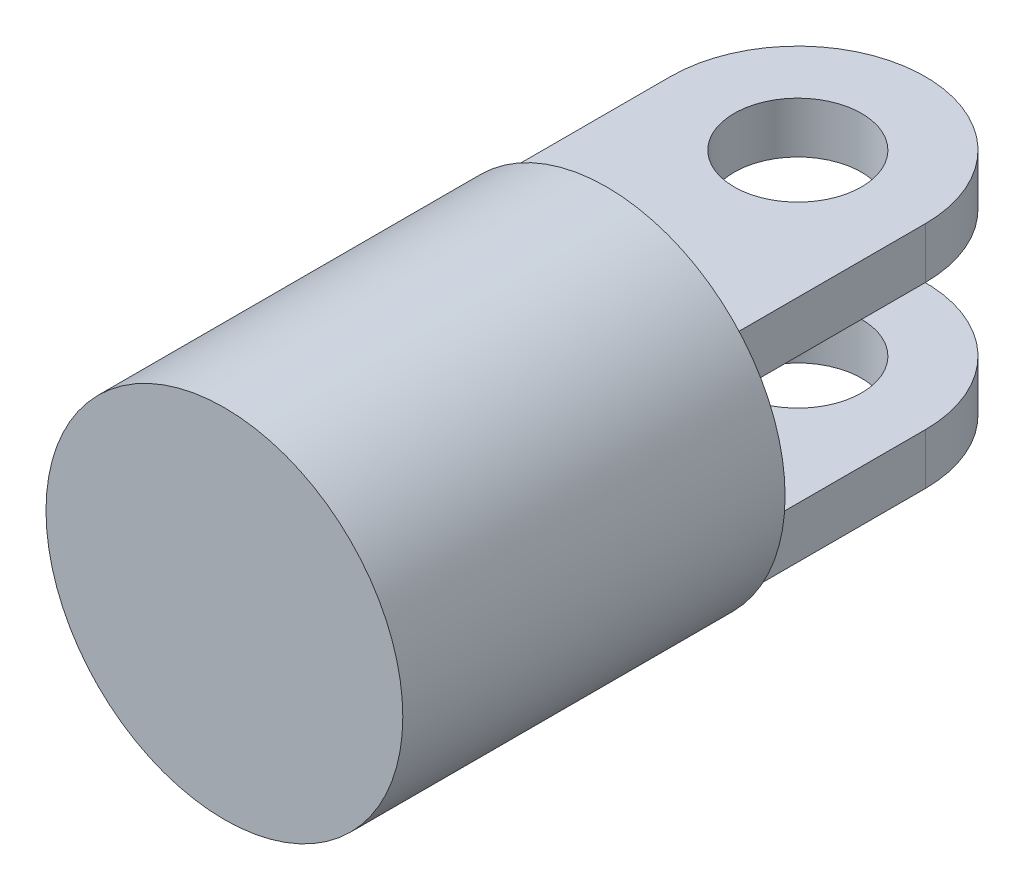
ISO-10303-21;
HEADER;
FILE_DESCRIPTION(('STEP AP214'),'2;1');
FILE_NAME('part.step','',(''),(''),'','','');
FILE_SCHEMA(('AUTOMOTIVE_DESIGN { 1 0 10303 214 1 1 1 1 }'));
ENDSEC;
DATA;
#1=APPLICATION_CONTEXT('core data for automotive mechanical design processes');
#2=APPLICATION_PROTOCOL_DEFINITION('international standard','automotive_design',2000,#1);
#3=PRODUCT_CONTEXT('',#1,'mechanical');
#4=PRODUCT('Part','Part','',(#3));
#5=PRODUCT_RELATED_PRODUCT_CATEGORY('part','',(#4));
#6=PRODUCT_DEFINITION_FORMATION('','',#4);
#7=PRODUCT_DEFINITION_CONTEXT('part definition',#1,'design');
#8=PRODUCT_DEFINITION('design','',#6,#7);
#9=PRODUCT_DEFINITION_SHAPE('','',#8);
#10=(LENGTH_UNIT() NAMED_UNIT(*) SI_UNIT(.MILLI.,.METRE.));
#11=(NAMED_UNIT(*) PLANE_ANGLE_UNIT() SI_UNIT($,.RADIAN.));
#12=(NAMED_UNIT(*) SI_UNIT($,.STERADIAN.) SOLID_ANGLE_UNIT());
#13=UNCERTAINTY_MEASURE_WITH_UNIT(LENGTH_MEASURE(1.E-05),#10,'distance_accuracy_value','');
#14=(GEOMETRIC_REPRESENTATION_CONTEXT(3) GLOBAL_UNCERTAINTY_ASSIGNED_CONTEXT((#13)) GLOBAL_UNIT_ASSIGNED_CONTEXT((#10,
#11,#12)) REPRESENTATION_CONTEXT('',''));
#15=CARTESIAN_POINT('',(0.,0.,0.));
#16=DIRECTION('',(0.,0.,1.));
#17=DIRECTION('',(1.,0.,0.));
#18=AXIS2_PLACEMENT_3D('',#15,#16,#17);
#19=CARTESIAN_POINT('',(0.,9.,-15.));
#20=DIRECTION('',(0.,-1.,0.));
#21=DIRECTION('',(0.,0.,-1.));
#22=AXIS2_PLACEMENT_3D('',#19,#20,#21);
#23=CYLINDRICAL_SURFACE('',#22,10.);
#24=CARTESIAN_POINT('',(0.,-5.,-15.));
#25=DIRECTION('',(0.,1.,0.));
#26=DIRECTION('',(0.,0.,1.));
#27=AXIS2_PLACEMENT_3D('',#24,#25,#26);
#28=CIRCLE('',#27,10.);
#29=CARTESIAN_POINT('',(10.,-5.,-15.));
#30=VERTEX_POINT('',#29);
#31=CARTESIAN_POINT('',(-10.,-5.,-15.));
#32=VERTEX_POINT('',#31);
#33=EDGE_CURVE('E107',#30,#32,#28,.T.);
#34=ORIENTED_EDGE('',*,*,#33,.F.);
#35=DIRECTION('',(0.,-1.,0.));
#36=VECTOR('',#35,1.);
#37=CARTESIAN_POINT('',(10.,9.,-15.));
#38=LINE('',#37,#36);
#39=CARTESIAN_POINT('',(10.,-9.,-15.));
#40=VERTEX_POINT('',#39);
#41=EDGE_CURVE('E149',#30,#40,#38,.T.);
#42=ORIENTED_EDGE('',*,*,#41,.T.);
#43=CARTESIAN_POINT('',(0.,-9.,-15.));
#44=DIRECTION('',(0.,1.,0.));
#45=DIRECTION('',(0.,0.,1.));
#46=AXIS2_PLACEMENT_3D('',#43,#44,#45);
#47=CIRCLE('',#46,10.);
#48=CARTESIAN_POINT('',(-10.,-9.,-15.));
#49=VERTEX_POINT('',#48);
#50=EDGE_CURVE('E129',#40,#49,#47,.T.);
#51=ORIENTED_EDGE('',*,*,#50,.T.);
#52=DIRECTION('',(0.,-1.,0.));
#53=VECTOR('',#52,1.);
#54=CARTESIAN_POINT('',(-10.,9.,-15.));
#55=LINE('',#54,#53);
#56=EDGE_CURVE('E122',#32,#49,#55,.T.);
#57=ORIENTED_EDGE('',*,*,#56,.F.);
#58=EDGE_LOOP('',(#34,#42,#51,#57));
#59=FACE_BOUND('',#58,.T.);
#60=ADVANCED_FACE('F39',(#59),#23,.T.);
#61=CARTESIAN_POINT('',(-10.,9.,-15.));
#62=DIRECTION('',(1.,0.,0.));
#63=DIRECTION('',(0.,0.,-1.));
#64=AXIS2_PLACEMENT_3D('',#61,#62,#63);
#65=PLANE('',#64);
#66=DIRECTION('',(0.,0.,1.));
#67=VECTOR('',#66,1.);
#68=CARTESIAN_POINT('',(-10.,-5.,-15.));
#69=LINE('',#68,#67);
#70=CARTESIAN_POINT('',(-10.,-5.,0.));
#71=VERTEX_POINT('',#70);
#72=EDGE_CURVE('E110',#32,#71,#69,.T.);
#73=ORIENTED_EDGE('',*,*,#72,.F.);
#74=ORIENTED_EDGE('',*,*,#56,.T.);
#75=DIRECTION('',(0.,0.,1.));
#76=VECTOR('',#75,1.);
#77=CARTESIAN_POINT('',(-10.,-9.,-15.));
#78=LINE('',#77,#76);
#79=CARTESIAN_POINT('',(-10.,-9.,0.));
#80=VERTEX_POINT('',#79);
#81=EDGE_CURVE('E158',#49,#80,#78,.T.);
#82=ORIENTED_EDGE('',*,*,#81,.T.);
#83=DIRECTION('',(0.,-1.,0.));
#84=VECTOR('',#83,1.);
#85=CARTESIAN_POINT('',(-10.,9.,0.));
#86=LINE('',#85,#84);
#87=EDGE_CURVE('E63',#71,#80,#86,.T.);
#88=ORIENTED_EDGE('',*,*,#87,.F.);
#89=EDGE_LOOP('',(#73,#74,#82,#88));
#90=FACE_BOUND('',#89,.T.);
#91=ADVANCED_FACE('F120',(#90),#65,.F.);
#92=CARTESIAN_POINT('',(10.,9.,-15.));
#93=DIRECTION('',(-1.,0.,0.));
#94=DIRECTION('',(0.,0.,1.));
#95=AXIS2_PLACEMENT_3D('',#92,#93,#94);
#96=PLANE('',#95);
#97=DIRECTION('',(0.,0.,-1.));
#98=VECTOR('',#97,1.);
#99=CARTESIAN_POINT('',(10.,-5.,-15.));
#100=LINE('',#99,#98);
#101=CARTESIAN_POINT('',(10.,-5.,0.));
#102=VERTEX_POINT('',#101);
#103=EDGE_CURVE('E112',#102,#30,#100,.T.);
#104=ORIENTED_EDGE('',*,*,#103,.F.);
#105=DIRECTION('',(0.,-1.,0.));
#106=VECTOR('',#105,1.);
#107=CARTESIAN_POINT('',(10.,9.,0.));
#108=LINE('',#107,#106);
#109=CARTESIAN_POINT('',(10.,-9.,0.));
#110=VERTEX_POINT('',#109);
#111=EDGE_CURVE('E144',#102,#110,#108,.T.);
#112=ORIENTED_EDGE('',*,*,#111,.T.);
#113=DIRECTION('',(0.,0.,-1.));
#114=VECTOR('',#113,1.);
#115=CARTESIAN_POINT('',(10.,-9.,-15.));
#116=LINE('',#115,#114);
#117=EDGE_CURVE('E150',#110,#40,#116,.T.);
#118=ORIENTED_EDGE('',*,*,#117,.T.);
#119=ORIENTED_EDGE('',*,*,#41,.F.);
#120=EDGE_LOOP('',(#104,#112,#118,#119));
#121=FACE_BOUND('',#120,.T.);
#122=ADVANCED_FACE('F228',(#121),#96,.F.);
#123=CARTESIAN_POINT('',(0.,9.,-15.));
#124=DIRECTION('',(0.,-1.,0.));
#125=DIRECTION('',(0.,0.,-1.));
#126=AXIS2_PLACEMENT_3D('',#123,#124,#125);
#127=CYLINDRICAL_SURFACE('',#126,5.);
#128=CARTESIAN_POINT('',(0.,-9.,-15.));
#129=DIRECTION('',(0.,1.,0.));
#130=DIRECTION('',(0.,0.,1.));
#131=AXIS2_PLACEMENT_3D('',#128,#129,#130);
#132=CIRCLE('',#131,5.);
#133=CARTESIAN_POINT('',(0.,-9.,-10.));
#134=VERTEX_POINT('',#133);
#135=EDGE_CURVE('E176',#134,#134,#132,.T.);
#136=ORIENTED_EDGE('',*,*,#135,.F.);
#137=EDGE_LOOP('',(#136));
#138=FACE_BOUND('',#137,.T.);
#139=CARTESIAN_POINT('',(0.,-5.,-15.));
#140=DIRECTION('',(0.,1.,0.));
#141=DIRECTION('',(0.,0.,1.));
#142=AXIS2_PLACEMENT_3D('',#139,#140,#141);
#143=CIRCLE('',#142,5.);
#144=CARTESIAN_POINT('',(0.,-5.,-10.));
#145=VERTEX_POINT('',#144);
#146=EDGE_CURVE('E194',#145,#145,#143,.T.);
#147=ORIENTED_EDGE('',*,*,#146,.T.);
#148=EDGE_LOOP('',(#147));
#149=FACE_BOUND('',#148,.T.);
#150=ADVANCED_FACE('F207',(#138,#149),#127,.F.);
#151=CARTESIAN_POINT('',(0.,0.,30.));
#152=DIRECTION('',(0.,0.,-1.));
#153=DIRECTION('',(-1.,0.,0.));
#154=AXIS2_PLACEMENT_3D('',#151,#152,#153);
#155=CYLINDRICAL_SURFACE('',#154,14.);
#156=CARTESIAN_POINT('',(0.,0.,30.));
#157=DIRECTION('',(0.,0.,1.));
#158=DIRECTION('',(1.,0.,0.));
#159=AXIS2_PLACEMENT_3D('',#156,#157,#158);
#160=CIRCLE('',#159,14.);
#161=CARTESIAN_POINT('',(14.,0.,30.));
#162=VERTEX_POINT('',#161);
#163=EDGE_CURVE('E11',#162,#162,#160,.T.);
#164=ORIENTED_EDGE('',*,*,#163,.F.);
#165=EDGE_LOOP('',(#164));
#166=FACE_BOUND('',#165,.T.);
#167=CARTESIAN_POINT('',(0.,0.,0.));
#168=DIRECTION('',(0.,0.,1.));
#169=DIRECTION('',(1.,0.,0.));
#170=AXIS2_PLACEMENT_3D('',#167,#168,#169);
#171=CIRCLE('',#170,14.);
#172=CARTESIAN_POINT('',(14.,0.,0.));
#173=VERTEX_POINT('',#172);
#174=EDGE_CURVE('E43',#173,#173,#171,.T.);
#175=ORIENTED_EDGE('',*,*,#174,.T.);
#176=EDGE_LOOP('',(#175));
#177=FACE_BOUND('',#176,.T.);
#178=ADVANCED_FACE('F41',(#166,#177),#155,.T.);
#179=CARTESIAN_POINT('',(0.,0.,30.));
#180=DIRECTION('',(0.,0.,1.));
#181=DIRECTION('',(1.,0.,0.));
#182=AXIS2_PLACEMENT_3D('',#179,#180,#181);
#183=PLANE('',#182);
#184=ORIENTED_EDGE('',*,*,#163,.T.);
#185=EDGE_LOOP('',(#184));
#186=FACE_BOUND('',#185,.T.);
#187=ADVANCED_FACE('F262',(#186),#183,.T.);
#188=CARTESIAN_POINT('',(0.,0.,0.));
#189=DIRECTION('',(0.,0.,1.));
#190=DIRECTION('',(1.,0.,0.));
#191=AXIS2_PLACEMENT_3D('',#188,#189,#190);
#192=PLANE('',#191);
#193=CARTESIAN_POINT('',(-10.,9.,0.));
#194=VERTEX_POINT('',#193);
#195=CARTESIAN_POINT('',(-10.,5.,0.));
#196=VERTEX_POINT('',#195);
#197=EDGE_CURVE('E132',#194,#196,#86,.T.);
#198=ORIENTED_EDGE('',*,*,#197,.T.);
#199=DIRECTION('',(1.,0.,0.));
#200=VECTOR('',#199,1.);
#201=CARTESIAN_POINT('',(-10.,5.,0.));
#202=LINE('',#201,#200);
#203=CARTESIAN_POINT('',(10.,5.,0.));
#204=VERTEX_POINT('',#203);
#205=EDGE_CURVE('E185',#196,#204,#202,.T.);
#206=ORIENTED_EDGE('',*,*,#205,.T.);
#207=CARTESIAN_POINT('',(10.,9.,0.));
#208=VERTEX_POINT('',#207);
#209=EDGE_CURVE('E140',#208,#204,#108,.T.);
#210=ORIENTED_EDGE('',*,*,#209,.F.);
#211=DIRECTION('',(1.,0.,0.));
#212=VECTOR('',#211,1.);
#213=CARTESIAN_POINT('',(-10.,9.,0.));
#214=LINE('',#213,#212);
#215=EDGE_CURVE('E167',#194,#208,#214,.T.);
#216=ORIENTED_EDGE('',*,*,#215,.F.);
#217=EDGE_LOOP('',(#198,#206,#210,#216));
#218=FACE_BOUND('',#217,.T.);
#219=DIRECTION('',(1.,0.,0.));
#220=VECTOR('',#219,1.);
#221=CARTESIAN_POINT('',(-10.,-5.,0.));
#222=LINE('',#221,#220);
#223=EDGE_CURVE('E125',#71,#102,#222,.T.);
#224=ORIENTED_EDGE('',*,*,#223,.F.);
#225=ORIENTED_EDGE('',*,*,#87,.T.);
#226=DIRECTION('',(1.,0.,0.));
#227=VECTOR('',#226,1.);
#228=CARTESIAN_POINT('',(-10.,-9.,0.));
#229=LINE('',#228,#227);
#230=EDGE_CURVE('E155',#80,#110,#229,.T.);
#231=ORIENTED_EDGE('',*,*,#230,.T.);
#232=ORIENTED_EDGE('',*,*,#111,.F.);
#233=EDGE_LOOP('',(#224,#225,#231,#232));
#234=FACE_BOUND('',#233,.T.);
#235=ORIENTED_EDGE('',*,*,#174,.F.);
#236=EDGE_LOOP('',(#235));
#237=FACE_BOUND('',#236,.T.);
#238=ADVANCED_FACE('F252',(#218,#234,#237),#192,.F.);
#239=CARTESIAN_POINT('',(0.,9.,-15.));
#240=DIRECTION('',(0.,1.,0.));
#241=DIRECTION('',(0.,0.,1.));
#242=AXIS2_PLACEMENT_3D('',#239,#240,#241);
#243=PLANE('',#242);
#244=CARTESIAN_POINT('',(0.,9.,-15.));
#245=DIRECTION('',(0.,1.,0.));
#246=DIRECTION('',(0.,0.,1.));
#247=AXIS2_PLACEMENT_3D('',#244,#245,#246);
#248=CIRCLE('',#247,10.);
#249=CARTESIAN_POINT('',(10.,9.,-15.));
#250=VERTEX_POINT('',#249);
#251=CARTESIAN_POINT('',(-10.,9.,-15.));
#252=VERTEX_POINT('',#251);
#253=EDGE_CURVE('E154',#250,#252,#248,.T.);
#254=ORIENTED_EDGE('',*,*,#253,.T.);
#255=DIRECTION('',(0.,0.,1.));
#256=VECTOR('',#255,1.);
#257=CARTESIAN_POINT('',(-10.,9.,-15.));
#258=LINE('',#257,#256);
#259=EDGE_CURVE('E170',#252,#194,#258,.T.);
#260=ORIENTED_EDGE('',*,*,#259,.T.);
#261=ORIENTED_EDGE('',*,*,#215,.T.);
#262=DIRECTION('',(0.,0.,-1.));
#263=VECTOR('',#262,1.);
#264=CARTESIAN_POINT('',(10.,9.,-15.));
#265=LINE('',#264,#263);
#266=EDGE_CURVE('E164',#208,#250,#265,.T.);
#267=ORIENTED_EDGE('',*,*,#266,.T.);
#268=EDGE_LOOP('',(#254,#260,#261,#267));
#269=FACE_BOUND('',#268,.T.);
#270=CARTESIAN_POINT('',(0.,9.,-15.));
#271=DIRECTION('',(0.,1.,0.));
#272=DIRECTION('',(0.,0.,1.));
#273=AXIS2_PLACEMENT_3D('',#270,#271,#272);
#274=CIRCLE('',#273,5.);
#275=CARTESIAN_POINT('',(0.,9.,-10.));
#276=VERTEX_POINT('',#275);
#277=EDGE_CURVE('E163',#276,#276,#274,.T.);
#278=ORIENTED_EDGE('',*,*,#277,.F.);
#279=EDGE_LOOP('',(#278));
#280=FACE_BOUND('',#279,.T.);
#281=ADVANCED_FACE('F240',(#269,#280),#243,.T.);
#282=CARTESIAN_POINT('',(0.,-9.,-15.));
#283=DIRECTION('',(0.,1.,0.));
#284=DIRECTION('',(0.,0.,1.));
#285=AXIS2_PLACEMENT_3D('',#282,#283,#284);
#286=PLANE('',#285);
#287=ORIENTED_EDGE('',*,*,#50,.F.);
#288=ORIENTED_EDGE('',*,*,#117,.F.);
#289=ORIENTED_EDGE('',*,*,#230,.F.);
#290=ORIENTED_EDGE('',*,*,#81,.F.);
#291=EDGE_LOOP('',(#287,#288,#289,#290));
#292=FACE_BOUND('',#291,.T.);
#293=ORIENTED_EDGE('',*,*,#135,.T.);
#294=EDGE_LOOP('',(#293));
#295=FACE_BOUND('',#294,.T.);
#296=ADVANCED_FACE('F233',(#292,#295),#286,.F.);
#297=CARTESIAN_POINT('',(10.,5.,-15.));
#298=VERTEX_POINT('',#297);
#299=EDGE_CURVE('E145',#250,#298,#38,.T.);
#300=ORIENTED_EDGE('',*,*,#299,.T.);
#301=CARTESIAN_POINT('',(0.,5.,-15.));
#302=DIRECTION('',(0.,1.,0.));
#303=DIRECTION('',(0.,0.,1.));
#304=AXIS2_PLACEMENT_3D('',#301,#302,#303);
#305=CIRCLE('',#304,10.);
#306=CARTESIAN_POINT('',(-10.,5.,-15.));
#307=VERTEX_POINT('',#306);
#308=EDGE_CURVE('E55',#298,#307,#305,.T.);
#309=ORIENTED_EDGE('',*,*,#308,.T.);
#310=EDGE_CURVE('E131',#252,#307,#55,.T.);
#311=ORIENTED_EDGE('',*,*,#310,.F.);
#312=ORIENTED_EDGE('',*,*,#253,.F.);
#313=EDGE_LOOP('',(#300,#309,#311,#312));
#314=FACE_BOUND('',#313,.T.);
#315=ADVANCED_FACE('F224',(#314),#23,.T.);
#316=ORIENTED_EDGE('',*,*,#310,.T.);
#317=DIRECTION('',(0.,0.,1.));
#318=VECTOR('',#317,1.);
#319=CARTESIAN_POINT('',(-10.,5.,-15.));
#320=LINE('',#319,#318);
#321=EDGE_CURVE('E188',#307,#196,#320,.T.);
#322=ORIENTED_EDGE('',*,*,#321,.T.);
#323=ORIENTED_EDGE('',*,*,#197,.F.);
#324=ORIENTED_EDGE('',*,*,#259,.F.);
#325=EDGE_LOOP('',(#316,#322,#323,#324));
#326=FACE_BOUND('',#325,.T.);
#327=ADVANCED_FACE('F230',(#326),#65,.F.);
#328=ORIENTED_EDGE('',*,*,#209,.T.);
#329=DIRECTION('',(0.,0.,-1.));
#330=VECTOR('',#329,1.);
#331=CARTESIAN_POINT('',(10.,5.,-15.));
#332=LINE('',#331,#330);
#333=EDGE_CURVE('E117',#204,#298,#332,.T.);
#334=ORIENTED_EDGE('',*,*,#333,.T.);
#335=ORIENTED_EDGE('',*,*,#299,.F.);
#336=ORIENTED_EDGE('',*,*,#266,.F.);
#337=EDGE_LOOP('',(#328,#334,#335,#336));
#338=FACE_BOUND('',#337,.T.);
#339=ADVANCED_FACE('F219',(#338),#96,.F.);
#340=CARTESIAN_POINT('',(0.,5.,-15.));
#341=DIRECTION('',(0.,1.,0.));
#342=DIRECTION('',(0.,0.,1.));
#343=AXIS2_PLACEMENT_3D('',#340,#341,#342);
#344=CIRCLE('',#343,5.);
#345=CARTESIAN_POINT('',(0.,5.,-10.));
#346=VERTEX_POINT('',#345);
#347=EDGE_CURVE('E199',#346,#346,#344,.T.);
#348=ORIENTED_EDGE('',*,*,#347,.F.);
#349=EDGE_LOOP('',(#348));
#350=FACE_BOUND('',#349,.T.);
#351=ORIENTED_EDGE('',*,*,#277,.T.);
#352=EDGE_LOOP('',(#351));
#353=FACE_BOUND('',#352,.T.);
#354=ADVANCED_FACE('F211',(#350,#353),#127,.F.);
#355=CARTESIAN_POINT('',(0.,-5.,-15.));
#356=DIRECTION('',(0.,1.,0.));
#357=DIRECTION('',(0.,0.,1.));
#358=AXIS2_PLACEMENT_3D('',#355,#356,#357);
#359=PLANE('',#358);
#360=ORIENTED_EDGE('',*,*,#146,.F.);
#361=EDGE_LOOP('',(#360));
#362=FACE_BOUND('',#361,.T.);
#363=ORIENTED_EDGE('',*,*,#33,.T.);
#364=ORIENTED_EDGE('',*,*,#72,.T.);
#365=ORIENTED_EDGE('',*,*,#223,.T.);
#366=ORIENTED_EDGE('',*,*,#103,.T.);
#367=EDGE_LOOP('',(#363,#364,#365,#366));
#368=FACE_BOUND('',#367,.T.);
#369=ADVANCED_FACE('F109',(#362,#368),#359,.T.);
#370=CARTESIAN_POINT('',(0.,5.,-15.));
#371=DIRECTION('',(0.,1.,0.));
#372=DIRECTION('',(0.,0.,1.));
#373=AXIS2_PLACEMENT_3D('',#370,#371,#372);
#374=PLANE('',#373);
#375=ORIENTED_EDGE('',*,*,#347,.T.);
#376=EDGE_LOOP('',(#375));
#377=FACE_BOUND('',#376,.T.);
#378=ORIENTED_EDGE('',*,*,#308,.F.);
#379=ORIENTED_EDGE('',*,*,#333,.F.);
#380=ORIENTED_EDGE('',*,*,#205,.F.);
#381=ORIENTED_EDGE('',*,*,#321,.F.);
#382=EDGE_LOOP('',(#378,#379,#380,#381));
#383=FACE_BOUND('',#382,.T.);
#384=ADVANCED_FACE('F210',(#377,#383),#374,.F.);
#385=CLOSED_SHELL('',(#60,#91,#122,#150,#178,#187,#238,#281,#296,#315,#327,#339,#354,#369,#384));
#386=MANIFOLD_SOLID_BREP('B2',#385);
#387=ADVANCED_BREP_SHAPE_REPRESENTATION('',(#18,#386),#14);
#388=SHAPE_DEFINITION_REPRESENTATION(#9,#387);
ENDSEC;
END-ISO-10303-21;
